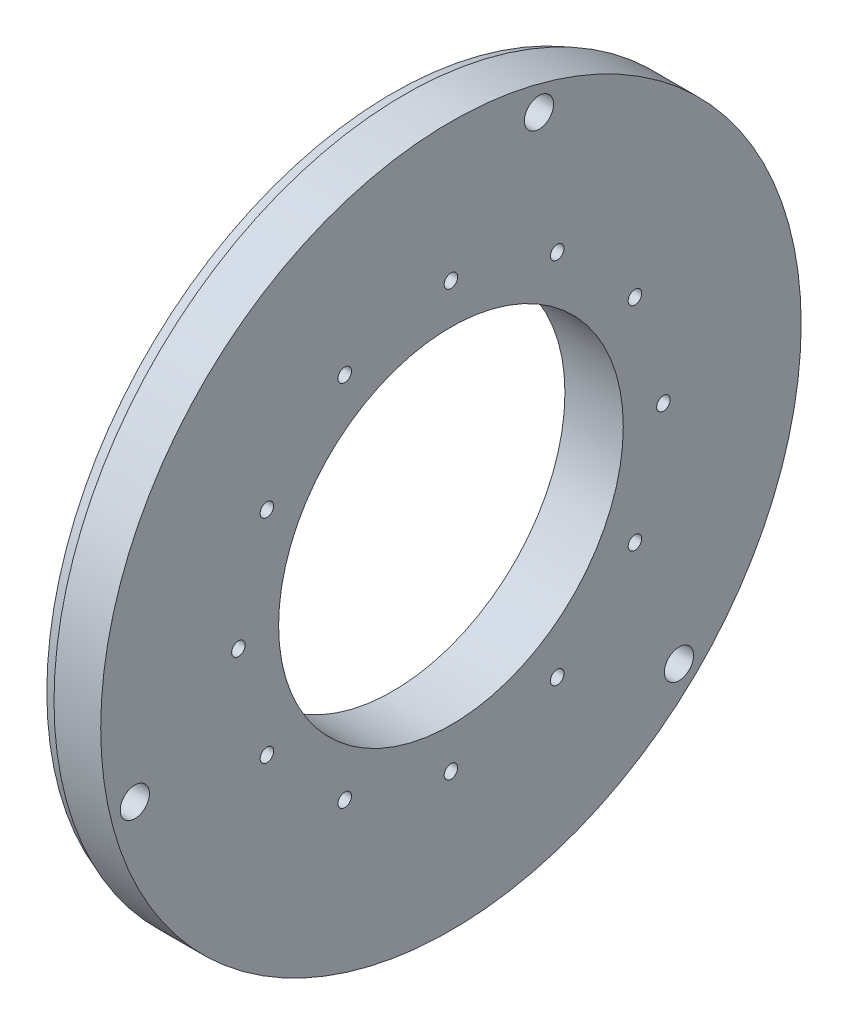
ISO-10303-21;
HEADER;
FILE_DESCRIPTION(('STEP AP214'),'2;1');
FILE_NAME('part.step','',(''),(''),'','','');
FILE_SCHEMA(('AUTOMOTIVE_DESIGN { 1 0 10303 214 1 1 1 1 }'));
ENDSEC;
DATA;
#1=APPLICATION_CONTEXT('core data for automotive mechanical design processes');
#2=APPLICATION_PROTOCOL_DEFINITION('international standard','automotive_design',2000,#1);
#3=PRODUCT_CONTEXT('',#1,'mechanical');
#4=PRODUCT('Part','Part','',(#3));
#5=PRODUCT_RELATED_PRODUCT_CATEGORY('part','',(#4));
#6=PRODUCT_DEFINITION_FORMATION('','',#4);
#7=PRODUCT_DEFINITION_CONTEXT('part definition',#1,'design');
#8=PRODUCT_DEFINITION('design','',#6,#7);
#9=PRODUCT_DEFINITION_SHAPE('','',#8);
#10=(LENGTH_UNIT() NAMED_UNIT(*) SI_UNIT(.MILLI.,.METRE.));
#11=(NAMED_UNIT(*) PLANE_ANGLE_UNIT() SI_UNIT($,.RADIAN.));
#12=(NAMED_UNIT(*) SI_UNIT($,.STERADIAN.) SOLID_ANGLE_UNIT());
#13=UNCERTAINTY_MEASURE_WITH_UNIT(LENGTH_MEASURE(1.E-05),#10,'distance_accuracy_value','');
#14=(GEOMETRIC_REPRESENTATION_CONTEXT(3) GLOBAL_UNCERTAINTY_ASSIGNED_CONTEXT((#13)) GLOBAL_UNIT_ASSIGNED_CONTEXT((#10,
#11,#12)) REPRESENTATION_CONTEXT('',''));
#15=CARTESIAN_POINT('',(0.,0.,0.));
#16=DIRECTION('',(0.,0.,1.));
#17=DIRECTION('',(1.,0.,0.));
#18=AXIS2_PLACEMENT_3D('',#15,#16,#17);
#19=CARTESIAN_POINT('',(12.7,0.,0.));
#20=DIRECTION('',(-1.,0.,0.));
#21=DIRECTION('',(0.,0.,1.));
#22=AXIS2_PLACEMENT_3D('',#19,#20,#21);
#23=CYLINDRICAL_SURFACE('',#22,76.2);
#24=CARTESIAN_POINT('',(12.7,0.,0.));
#25=DIRECTION('',(1.,0.,0.));
#26=DIRECTION('',(0.,0.,-1.));
#27=AXIS2_PLACEMENT_3D('',#24,#25,#26);
#28=CIRCLE('',#27,76.2);
#29=CARTESIAN_POINT('',(12.7,0.,-76.2));
#30=VERTEX_POINT('',#29);
#31=EDGE_CURVE('E11',#30,#30,#28,.T.);
#32=ORIENTED_EDGE('',*,*,#31,.F.);
#33=EDGE_LOOP('',(#32));
#34=FACE_BOUND('',#33,.T.);
#35=CARTESIAN_POINT('',(2.54,0.,0.));
#36=DIRECTION('',(-1.,0.,0.));
#37=DIRECTION('',(0.,0.,1.));
#38=AXIS2_PLACEMENT_3D('',#35,#36,#37);
#39=CIRCLE('',#38,76.2);
#40=CARTESIAN_POINT('',(2.54,0.,76.2));
#41=VERTEX_POINT('',#40);
#42=EDGE_CURVE('E46',#41,#41,#39,.T.);
#43=ORIENTED_EDGE('',*,*,#42,.F.);
#44=EDGE_LOOP('',(#43));
#45=FACE_BOUND('',#44,.T.);
#46=ADVANCED_FACE('F43',(#34,#45),#23,.T.);
#47=CARTESIAN_POINT('',(0.,0.,0.));
#48=DIRECTION('',(1.,0.,0.));
#49=DIRECTION('',(0.,0.,-1.));
#50=AXIS2_PLACEMENT_3D('',#47,#48,#49);
#51=PLANE('',#50);
#52=CARTESIAN_POINT('',(0.,0.,0.));
#53=DIRECTION('',(1.,0.,0.));
#54=DIRECTION('',(0.,0.,-1.));
#55=AXIS2_PLACEMENT_3D('',#52,#53,#54);
#56=CIRCLE('',#55,37.5);
#57=CARTESIAN_POINT('',(0.,0.,-37.5));
#58=VERTEX_POINT('',#57);
#59=EDGE_CURVE('E51',#58,#58,#56,.T.);
#60=ORIENTED_EDGE('',*,*,#59,.T.);
#61=EDGE_LOOP('',(#60));
#62=FACE_BOUND('',#61,.T.);
#63=CARTESIAN_POINT('',(0.,46.228,0.));
#64=DIRECTION('',(1.,0.,0.));
#65=DIRECTION('',(0.,0.,-1.));
#66=AXIS2_PLACEMENT_3D('',#63,#64,#65);
#67=CIRCLE('',#66,1.4732);
#68=CARTESIAN_POINT('',(0.,46.228,-1.4732));
#69=VERTEX_POINT('',#68);
#70=EDGE_CURVE('E61',#69,#69,#67,.T.);
#71=ORIENTED_EDGE('',*,*,#70,.T.);
#72=EDGE_LOOP('',(#71));
#73=FACE_BOUND('',#72,.T.);
#74=CARTESIAN_POINT('',(0.,40.034622366147,23.114));
#75=DIRECTION('',(1.,0.,0.));
#76=DIRECTION('',(0.,0.500000000000001,-0.866025403784438));
#77=AXIS2_PLACEMENT_3D('',#74,#75,#76);
#78=CIRCLE('',#77,1.4732);
#79=CARTESIAN_POINT('',(0.,40.771222366147,21.8381713751448));
#80=VERTEX_POINT('',#79);
#81=EDGE_CURVE('E67',#80,#80,#78,.T.);
#82=ORIENTED_EDGE('',*,*,#81,.T.);
#83=EDGE_LOOP('',(#82));
#84=FACE_BOUND('',#83,.T.);
#85=CARTESIAN_POINT('',(0.,40.0346223661473,-23.1139999999995));
#86=DIRECTION('',(1.,0.,0.));
#87=DIRECTION('',(0.,-0.499999999999989,-0.866025403784445));
#88=AXIS2_PLACEMENT_3D('',#85,#86,#87);
#89=CIRCLE('',#88,1.4732);
#90=CARTESIAN_POINT('',(0.,39.2980223661473,-24.3898286248547));
#91=VERTEX_POINT('',#90);
#92=EDGE_CURVE('E147',#91,#91,#89,.T.);
#93=ORIENTED_EDGE('',*,*,#92,.T.);
#94=EDGE_LOOP('',(#93));
#95=FACE_BOUND('',#94,.T.);
#96=CARTESIAN_POINT('',(0.,23.1140000000005,-40.0346223661468));
#97=DIRECTION('',(1.,0.,0.));
#98=DIRECTION('',(0.,-0.866025403784433,-0.50000000000001));
#99=AXIS2_PLACEMENT_3D('',#96,#97,#98);
#100=CIRCLE('',#99,1.4732);
#101=CARTESIAN_POINT('',(0.,21.8381713751452,-40.7712223661468));
#102=VERTEX_POINT('',#101);
#103=EDGE_CURVE('E84',#102,#102,#100,.T.);
#104=ORIENTED_EDGE('',*,*,#103,.T.);
#105=EDGE_LOOP('',(#104));
#106=FACE_BOUND('',#105,.T.);
#107=CARTESIAN_POINT('',(0.,4.84212597996121E-13,-46.228));
#108=DIRECTION('',(1.,0.,0.));
#109=DIRECTION('',(0.,-1.,0.));
#110=AXIS2_PLACEMENT_3D('',#107,#108,#109);
#111=CIRCLE('',#110,1.4732);
#112=CARTESIAN_POINT('',(0.,-1.47319999999952,-46.228));
#113=VERTEX_POINT('',#112);
#114=EDGE_CURVE('E83',#113,#113,#111,.T.);
#115=ORIENTED_EDGE('',*,*,#114,.T.);
#116=EDGE_LOOP('',(#115));
#117=FACE_BOUND('',#116,.T.);
#118=CARTESIAN_POINT('',(0.,-23.1139999999996,-40.0346223661472));
#119=DIRECTION('',(1.,0.,0.));
#120=DIRECTION('',(0.,-0.866025403784443,0.499999999999992));
#121=AXIS2_PLACEMENT_3D('',#118,#119,#120);
#122=CIRCLE('',#121,1.4732);
#123=CARTESIAN_POINT('',(0.,-24.3898286248549,-39.2980223661473));
#124=VERTEX_POINT('',#123);
#125=EDGE_CURVE('E92',#124,#124,#122,.T.);
#126=ORIENTED_EDGE('',*,*,#125,.T.);
#127=EDGE_LOOP('',(#126));
#128=FACE_BOUND('',#127,.T.);
#129=CARTESIAN_POINT('',(0.,-40.0346223661468,-23.1140000000003));
#130=DIRECTION('',(1.,0.,0.));
#131=DIRECTION('',(0.,-0.500000000000007,0.866025403784435));
#132=AXIS2_PLACEMENT_3D('',#129,#130,#131);
#133=CIRCLE('',#132,1.4732);
#134=CARTESIAN_POINT('',(0.,-40.7712223661469,-21.8381713751451));
#135=VERTEX_POINT('',#134);
#136=EDGE_CURVE('E100',#135,#135,#133,.T.);
#137=ORIENTED_EDGE('',*,*,#136,.T.);
#138=EDGE_LOOP('',(#137));
#139=FACE_BOUND('',#138,.T.);
#140=CARTESIAN_POINT('',(0.,-46.228,0.));
#141=DIRECTION('',(1.,0.,0.));
#142=DIRECTION('',(0.,0.,1.));
#143=AXIS2_PLACEMENT_3D('',#140,#141,#142);
#144=CIRCLE('',#143,1.4732);
#145=CARTESIAN_POINT('',(0.,-46.228,1.4732));
#146=VERTEX_POINT('',#145);
#147=EDGE_CURVE('E108',#146,#146,#144,.T.);
#148=ORIENTED_EDGE('',*,*,#147,.T.);
#149=EDGE_LOOP('',(#148));
#150=FACE_BOUND('',#149,.T.);
#151=CARTESIAN_POINT('',(0.,-40.0346223661472,23.1139999999998));
#152=DIRECTION('',(1.,0.,0.));
#153=DIRECTION('',(0.,0.499999999999995,0.866025403784442));
#154=AXIS2_PLACEMENT_3D('',#151,#152,#153);
#155=CIRCLE('',#154,1.4732);
#156=CARTESIAN_POINT('',(0.,-39.2980223661472,24.389828624855));
#157=VERTEX_POINT('',#156);
#158=EDGE_CURVE('E116',#157,#157,#155,.T.);
#159=ORIENTED_EDGE('',*,*,#158,.T.);
#160=EDGE_LOOP('',(#159));
#161=FACE_BOUND('',#160,.T.);
#162=CARTESIAN_POINT('',(0.,-23.1140000000002,40.0346223661469));
#163=DIRECTION('',(1.,0.,0.));
#164=DIRECTION('',(0.,0.866025403784436,0.500000000000004));
#165=AXIS2_PLACEMENT_3D('',#162,#163,#164);
#166=CIRCLE('',#165,1.4732);
#167=CARTESIAN_POINT('',(0.,-21.838171375145,40.7712223661469));
#168=VERTEX_POINT('',#167);
#169=EDGE_CURVE('E124',#168,#168,#166,.T.);
#170=ORIENTED_EDGE('',*,*,#169,.T.);
#171=EDGE_LOOP('',(#170));
#172=FACE_BOUND('',#171,.T.);
#173=CARTESIAN_POINT('',(0.,-1.6140419933204E-13,46.228));
#174=DIRECTION('',(1.,0.,0.));
#175=DIRECTION('',(0.,1.,0.));
#176=AXIS2_PLACEMENT_3D('',#173,#174,#175);
#177=CIRCLE('',#176,1.4732);
#178=CARTESIAN_POINT('',(0.,1.47319999999984,46.228));
#179=VERTEX_POINT('',#178);
#180=EDGE_CURVE('E132',#179,#179,#177,.T.);
#181=ORIENTED_EDGE('',*,*,#180,.T.);
#182=EDGE_LOOP('',(#181));
#183=FACE_BOUND('',#182,.T.);
#184=CARTESIAN_POINT('',(0.,23.1139999999999,40.0346223661471));
#185=DIRECTION('',(1.,0.,0.));
#186=DIRECTION('',(0.,0.86602540378444,-0.499999999999998));
#187=AXIS2_PLACEMENT_3D('',#184,#185,#186);
#188=CIRCLE('',#187,1.4732);
#189=CARTESIAN_POINT('',(0.,24.3898286248551,39.2980223661471));
#190=VERTEX_POINT('',#189);
#191=EDGE_CURVE('E75',#190,#190,#188,.T.);
#192=ORIENTED_EDGE('',*,*,#191,.T.);
#193=EDGE_LOOP('',(#192));
#194=FACE_BOUND('',#193,.T.);
#195=CARTESIAN_POINT('',(0.,68.3533593475034,-19.1596537564972));
#196=DIRECTION('',(1.,0.,0.));
#197=DIRECTION('',(0.,0.,-1.));
#198=AXIS2_PLACEMENT_3D('',#195,#196,#197);
#199=CIRCLE('',#198,3.175);
#200=CARTESIAN_POINT('',(0.,68.3533593475034,-22.3346537564972));
#201=VERTEX_POINT('',#200);
#202=EDGE_CURVE('E148',#201,#201,#199,.T.);
#203=ORIENTED_EDGE('',*,*,#202,.T.);
#204=EDGE_LOOP('',(#203));
#205=FACE_BOUND('',#204,.T.);
#206=CARTESIAN_POINT('',(0.,-50.7694265545918,-49.6159187506964));
#207=DIRECTION('',(1.,0.,0.));
#208=DIRECTION('',(0.,-0.866025403784443,0.499999999999992));
#209=AXIS2_PLACEMENT_3D('',#206,#207,#208);
#210=CIRCLE('',#209,3.175);
#211=CARTESIAN_POINT('',(0.,-53.5190572116074,-48.0284187506964));
#212=VERTEX_POINT('',#211);
#213=EDGE_CURVE('E171',#212,#212,#210,.T.);
#214=ORIENTED_EDGE('',*,*,#213,.T.);
#215=EDGE_LOOP('',(#214));
#216=FACE_BOUND('',#215,.T.);
#217=CARTESIAN_POINT('',(0.,-17.5839327929115,68.775572507193));
#218=DIRECTION('',(1.,0.,0.));
#219=DIRECTION('',(0.,0.866025403784436,0.500000000000004));
#220=AXIS2_PLACEMENT_3D('',#217,#218,#219);
#221=CIRCLE('',#220,3.175);
#222=CARTESIAN_POINT('',(0.,-14.834302135896,70.363072507193));
#223=VERTEX_POINT('',#222);
#224=EDGE_CURVE('E163',#223,#223,#221,.T.);
#225=ORIENTED_EDGE('',*,*,#224,.T.);
#226=EDGE_LOOP('',(#225));
#227=FACE_BOUND('',#226,.T.);
#228=CARTESIAN_POINT('',(0.,0.,0.));
#229=DIRECTION('',(-1.,0.,0.));
#230=DIRECTION('',(0.,0.,1.));
#231=AXIS2_PLACEMENT_3D('',#228,#229,#230);
#232=CIRCLE('',#231,75.2221);
#233=CARTESIAN_POINT('',(0.,0.,75.2221));
#234=VERTEX_POINT('',#233);
#235=EDGE_CURVE('E182',#234,#234,#232,.T.);
#236=ORIENTED_EDGE('',*,*,#235,.T.);
#237=EDGE_LOOP('',(#236));
#238=FACE_BOUND('',#237,.T.);
#239=ADVANCED_FACE('F198',(#62,#73,#84,#95,#106,#117,#128,#139,#150,#161,#172,#183,#194,#205,
#216,#227,#238),#51,.F.);
#240=CARTESIAN_POINT('',(12.7,0.,0.));
#241=DIRECTION('',(1.,0.,0.));
#242=DIRECTION('',(0.,0.,-1.));
#243=AXIS2_PLACEMENT_3D('',#240,#241,#242);
#244=PLANE('',#243);
#245=CARTESIAN_POINT('',(12.7,-17.5839327929115,68.775572507193));
#246=DIRECTION('',(1.,0.,0.));
#247=DIRECTION('',(0.,0.866025403784436,0.500000000000004));
#248=AXIS2_PLACEMENT_3D('',#245,#246,#247);
#249=CIRCLE('',#248,3.175);
#250=CARTESIAN_POINT('',(12.7,-14.834302135896,70.363072507193));
#251=VERTEX_POINT('',#250);
#252=EDGE_CURVE('E175',#251,#251,#249,.T.);
#253=ORIENTED_EDGE('',*,*,#252,.F.);
#254=EDGE_LOOP('',(#253));
#255=FACE_BOUND('',#254,.T.);
#256=CARTESIAN_POINT('',(12.7,-50.7694265545918,-49.6159187506964));
#257=DIRECTION('',(1.,0.,0.));
#258=DIRECTION('',(0.,-0.866025403784443,0.499999999999992));
#259=AXIS2_PLACEMENT_3D('',#256,#257,#258);
#260=CIRCLE('',#259,3.175);
#261=CARTESIAN_POINT('',(12.7,-53.5190572116074,-48.0284187506964));
#262=VERTEX_POINT('',#261);
#263=EDGE_CURVE('E167',#262,#262,#260,.T.);
#264=ORIENTED_EDGE('',*,*,#263,.F.);
#265=EDGE_LOOP('',(#264));
#266=FACE_BOUND('',#265,.T.);
#267=CARTESIAN_POINT('',(12.7,68.3533593475034,-19.1596537564972));
#268=DIRECTION('',(1.,0.,0.));
#269=DIRECTION('',(0.,0.,-1.));
#270=AXIS2_PLACEMENT_3D('',#267,#268,#269);
#271=CIRCLE('',#270,3.175);
#272=CARTESIAN_POINT('',(12.7,68.3533593475034,-22.3346537564972));
#273=VERTEX_POINT('',#272);
#274=EDGE_CURVE('E159',#273,#273,#271,.T.);
#275=ORIENTED_EDGE('',*,*,#274,.F.);
#276=EDGE_LOOP('',(#275));
#277=FACE_BOUND('',#276,.T.);
#278=CARTESIAN_POINT('',(12.7,23.1139999999999,40.0346223661471));
#279=DIRECTION('',(1.,0.,0.));
#280=DIRECTION('',(0.,0.86602540378444,-0.499999999999998));
#281=AXIS2_PLACEMENT_3D('',#278,#279,#280);
#282=CIRCLE('',#281,1.4732);
#283=CARTESIAN_POINT('',(12.7,24.3898286248551,39.2980223661471));
#284=VERTEX_POINT('',#283);
#285=EDGE_CURVE('E136',#284,#284,#282,.T.);
#286=ORIENTED_EDGE('',*,*,#285,.F.);
#287=EDGE_LOOP('',(#286));
#288=FACE_BOUND('',#287,.T.);
#289=CARTESIAN_POINT('',(12.7,-1.6140419933204E-13,46.228));
#290=DIRECTION('',(1.,0.,0.));
#291=DIRECTION('',(0.,1.,0.));
#292=AXIS2_PLACEMENT_3D('',#289,#290,#291);
#293=CIRCLE('',#292,1.4732);
#294=CARTESIAN_POINT('',(12.7,1.47319999999984,46.228));
#295=VERTEX_POINT('',#294);
#296=EDGE_CURVE('E128',#295,#295,#293,.T.);
#297=ORIENTED_EDGE('',*,*,#296,.F.);
#298=EDGE_LOOP('',(#297));
#299=FACE_BOUND('',#298,.T.);
#300=CARTESIAN_POINT('',(12.7,-23.1140000000002,40.0346223661469));
#301=DIRECTION('',(1.,0.,0.));
#302=DIRECTION('',(0.,0.866025403784436,0.500000000000004));
#303=AXIS2_PLACEMENT_3D('',#300,#301,#302);
#304=CIRCLE('',#303,1.4732);
#305=CARTESIAN_POINT('',(12.7,-21.838171375145,40.7712223661469));
#306=VERTEX_POINT('',#305);
#307=EDGE_CURVE('E120',#306,#306,#304,.T.);
#308=ORIENTED_EDGE('',*,*,#307,.F.);
#309=EDGE_LOOP('',(#308));
#310=FACE_BOUND('',#309,.T.);
#311=CARTESIAN_POINT('',(12.7,-40.0346223661472,23.1139999999998));
#312=DIRECTION('',(1.,0.,0.));
#313=DIRECTION('',(0.,0.499999999999995,0.866025403784442));
#314=AXIS2_PLACEMENT_3D('',#311,#312,#313);
#315=CIRCLE('',#314,1.4732);
#316=CARTESIAN_POINT('',(12.7,-39.2980223661472,24.389828624855));
#317=VERTEX_POINT('',#316);
#318=EDGE_CURVE('E112',#317,#317,#315,.T.);
#319=ORIENTED_EDGE('',*,*,#318,.F.);
#320=EDGE_LOOP('',(#319));
#321=FACE_BOUND('',#320,.T.);
#322=CARTESIAN_POINT('',(12.7,-46.228,0.));
#323=DIRECTION('',(1.,0.,0.));
#324=DIRECTION('',(0.,0.,1.));
#325=AXIS2_PLACEMENT_3D('',#322,#323,#324);
#326=CIRCLE('',#325,1.4732);
#327=CARTESIAN_POINT('',(12.7,-46.228,1.4732));
#328=VERTEX_POINT('',#327);
#329=EDGE_CURVE('E104',#328,#328,#326,.T.);
#330=ORIENTED_EDGE('',*,*,#329,.F.);
#331=EDGE_LOOP('',(#330));
#332=FACE_BOUND('',#331,.T.);
#333=CARTESIAN_POINT('',(12.7,-40.0346223661468,-23.1140000000003));
#334=DIRECTION('',(1.,0.,0.));
#335=DIRECTION('',(0.,-0.500000000000007,0.866025403784435));
#336=AXIS2_PLACEMENT_3D('',#333,#334,#335);
#337=CIRCLE('',#336,1.4732);
#338=CARTESIAN_POINT('',(12.7,-40.7712223661469,-21.8381713751451));
#339=VERTEX_POINT('',#338);
#340=EDGE_CURVE('E96',#339,#339,#337,.T.);
#341=ORIENTED_EDGE('',*,*,#340,.F.);
#342=EDGE_LOOP('',(#341));
#343=FACE_BOUND('',#342,.T.);
#344=CARTESIAN_POINT('',(12.7,-23.1139999999996,-40.0346223661472));
#345=DIRECTION('',(1.,0.,0.));
#346=DIRECTION('',(0.,-0.866025403784443,0.499999999999992));
#347=AXIS2_PLACEMENT_3D('',#344,#345,#346);
#348=CIRCLE('',#347,1.4732);
#349=CARTESIAN_POINT('',(12.7,-24.3898286248549,-39.2980223661473));
#350=VERTEX_POINT('',#349);
#351=EDGE_CURVE('E88',#350,#350,#348,.T.);
#352=ORIENTED_EDGE('',*,*,#351,.F.);
#353=EDGE_LOOP('',(#352));
#354=FACE_BOUND('',#353,.T.);
#355=CARTESIAN_POINT('',(12.7,4.84212597996121E-13,-46.228));
#356=DIRECTION('',(1.,0.,0.));
#357=DIRECTION('',(0.,-1.,0.));
#358=AXIS2_PLACEMENT_3D('',#355,#356,#357);
#359=CIRCLE('',#358,1.4732);
#360=CARTESIAN_POINT('',(12.7,-1.47319999999952,-46.228));
#361=VERTEX_POINT('',#360);
#362=EDGE_CURVE('E79',#361,#361,#359,.T.);
#363=ORIENTED_EDGE('',*,*,#362,.F.);
#364=EDGE_LOOP('',(#363));
#365=FACE_BOUND('',#364,.T.);
#366=CARTESIAN_POINT('',(12.7,23.1140000000005,-40.0346223661468));
#367=DIRECTION('',(1.,0.,0.));
#368=DIRECTION('',(0.,-0.866025403784433,-0.50000000000001));
#369=AXIS2_PLACEMENT_3D('',#366,#367,#368);
#370=CIRCLE('',#369,1.4732);
#371=CARTESIAN_POINT('',(12.7,21.8381713751452,-40.7712223661468));
#372=VERTEX_POINT('',#371);
#373=EDGE_CURVE('E152',#372,#372,#370,.T.);
#374=ORIENTED_EDGE('',*,*,#373,.F.);
#375=EDGE_LOOP('',(#374));
#376=FACE_BOUND('',#375,.T.);
#377=CARTESIAN_POINT('',(12.7,40.0346223661473,-23.1139999999995));
#378=DIRECTION('',(1.,0.,0.));
#379=DIRECTION('',(0.,-0.499999999999989,-0.866025403784445));
#380=AXIS2_PLACEMENT_3D('',#377,#378,#379);
#381=CIRCLE('',#380,1.4732);
#382=CARTESIAN_POINT('',(12.7,39.2980223661473,-24.3898286248547));
#383=VERTEX_POINT('',#382);
#384=EDGE_CURVE('E143',#383,#383,#381,.T.);
#385=ORIENTED_EDGE('',*,*,#384,.F.);
#386=EDGE_LOOP('',(#385));
#387=FACE_BOUND('',#386,.T.);
#388=CARTESIAN_POINT('',(12.7,40.034622366147,23.114));
#389=DIRECTION('',(1.,0.,0.));
#390=DIRECTION('',(0.,0.500000000000001,-0.866025403784438));
#391=AXIS2_PLACEMENT_3D('',#388,#389,#390);
#392=CIRCLE('',#391,1.4732);
#393=CARTESIAN_POINT('',(12.7,40.771222366147,21.8381713751448));
#394=VERTEX_POINT('',#393);
#395=EDGE_CURVE('E71',#394,#394,#392,.T.);
#396=ORIENTED_EDGE('',*,*,#395,.F.);
#397=EDGE_LOOP('',(#396));
#398=FACE_BOUND('',#397,.T.);
#399=CARTESIAN_POINT('',(12.7,46.228,0.));
#400=DIRECTION('',(1.,0.,0.));
#401=DIRECTION('',(0.,0.,-1.));
#402=AXIS2_PLACEMENT_3D('',#399,#400,#401);
#403=CIRCLE('',#402,1.4732);
#404=CARTESIAN_POINT('',(12.7,46.228,-1.4732));
#405=VERTEX_POINT('',#404);
#406=EDGE_CURVE('E63',#405,#405,#403,.T.);
#407=ORIENTED_EDGE('',*,*,#406,.F.);
#408=EDGE_LOOP('',(#407));
#409=FACE_BOUND('',#408,.T.);
#410=CARTESIAN_POINT('',(12.7,0.,0.));
#411=DIRECTION('',(1.,0.,0.));
#412=DIRECTION('',(0.,0.,-1.));
#413=AXIS2_PLACEMENT_3D('',#410,#411,#412);
#414=CIRCLE('',#413,37.5);
#415=CARTESIAN_POINT('',(12.7,0.,-37.5));
#416=VERTEX_POINT('',#415);
#417=EDGE_CURVE('E56',#416,#416,#414,.T.);
#418=ORIENTED_EDGE('',*,*,#417,.F.);
#419=EDGE_LOOP('',(#418));
#420=FACE_BOUND('',#419,.T.);
#421=ORIENTED_EDGE('',*,*,#31,.T.);
#422=EDGE_LOOP('',(#421));
#423=FACE_BOUND('',#422,.T.);
#424=ADVANCED_FACE('F204',(#255,#266,#277,#288,#299,#310,#321,#332,#343,#354,#365,#376,#387,
#398,#409,#420,#423),#244,.T.);
#425=CARTESIAN_POINT('',(0.,0.,0.));
#426=DIRECTION('',(1.,0.,0.));
#427=DIRECTION('',(0.,0.,-1.));
#428=AXIS2_PLACEMENT_3D('',#425,#426,#427);
#429=CYLINDRICAL_SURFACE('',#428,37.5);
#430=ORIENTED_EDGE('',*,*,#59,.F.);
#431=EDGE_LOOP('',(#430));
#432=FACE_BOUND('',#431,.T.);
#433=ORIENTED_EDGE('',*,*,#417,.T.);
#434=EDGE_LOOP('',(#433));
#435=FACE_BOUND('',#434,.T.);
#436=ADVANCED_FACE('F210',(#432,#435),#429,.F.);
#437=CARTESIAN_POINT('',(0.,46.228,0.));
#438=DIRECTION('',(1.,0.,0.));
#439=DIRECTION('',(0.,0.,-1.));
#440=AXIS2_PLACEMENT_3D('',#437,#438,#439);
#441=CYLINDRICAL_SURFACE('',#440,1.4732);
#442=ORIENTED_EDGE('',*,*,#70,.F.);
#443=EDGE_LOOP('',(#442));
#444=FACE_BOUND('',#443,.T.);
#445=ORIENTED_EDGE('',*,*,#406,.T.);
#446=EDGE_LOOP('',(#445));
#447=FACE_BOUND('',#446,.T.);
#448=ADVANCED_FACE('F217',(#444,#447),#441,.F.);
#449=CARTESIAN_POINT('',(0.,40.034622366147,23.114));
#450=DIRECTION('',(1.,0.,0.));
#451=DIRECTION('',(0.,0.,-1.));
#452=AXIS2_PLACEMENT_3D('',#449,#450,#451);
#453=CYLINDRICAL_SURFACE('',#452,1.4732);
#454=ORIENTED_EDGE('',*,*,#81,.F.);
#455=EDGE_LOOP('',(#454));
#456=FACE_BOUND('',#455,.T.);
#457=ORIENTED_EDGE('',*,*,#395,.T.);
#458=EDGE_LOOP('',(#457));
#459=FACE_BOUND('',#458,.T.);
#460=ADVANCED_FACE('F221',(#456,#459),#453,.F.);
#461=CARTESIAN_POINT('',(0.,40.0346223661473,-23.1139999999995));
#462=DIRECTION('',(1.,0.,0.));
#463=DIRECTION('',(0.,0.,-1.));
#464=AXIS2_PLACEMENT_3D('',#461,#462,#463);
#465=CYLINDRICAL_SURFACE('',#464,1.4732);
#466=ORIENTED_EDGE('',*,*,#92,.F.);
#467=EDGE_LOOP('',(#466));
#468=FACE_BOUND('',#467,.T.);
#469=ORIENTED_EDGE('',*,*,#384,.T.);
#470=EDGE_LOOP('',(#469));
#471=FACE_BOUND('',#470,.T.);
#472=ADVANCED_FACE('F225',(#468,#471),#465,.F.);
#473=CARTESIAN_POINT('',(0.,23.1140000000005,-40.0346223661468));
#474=DIRECTION('',(1.,0.,0.));
#475=DIRECTION('',(0.,0.,-1.));
#476=AXIS2_PLACEMENT_3D('',#473,#474,#475);
#477=CYLINDRICAL_SURFACE('',#476,1.4732);
#478=ORIENTED_EDGE('',*,*,#103,.F.);
#479=EDGE_LOOP('',(#478));
#480=FACE_BOUND('',#479,.T.);
#481=ORIENTED_EDGE('',*,*,#373,.T.);
#482=EDGE_LOOP('',(#481));
#483=FACE_BOUND('',#482,.T.);
#484=ADVANCED_FACE('F231',(#480,#483),#477,.F.);
#485=CARTESIAN_POINT('',(0.,4.84212597996121E-13,-46.228));
#486=DIRECTION('',(1.,0.,0.));
#487=DIRECTION('',(0.,0.,-1.));
#488=AXIS2_PLACEMENT_3D('',#485,#486,#487);
#489=CYLINDRICAL_SURFACE('',#488,1.4732);
#490=ORIENTED_EDGE('',*,*,#114,.F.);
#491=EDGE_LOOP('',(#490));
#492=FACE_BOUND('',#491,.T.);
#493=ORIENTED_EDGE('',*,*,#362,.T.);
#494=EDGE_LOOP('',(#493));
#495=FACE_BOUND('',#494,.T.);
#496=ADVANCED_FACE('F227',(#492,#495),#489,.F.);
#497=CARTESIAN_POINT('',(0.,-23.1139999999996,-40.0346223661472));
#498=DIRECTION('',(1.,0.,0.));
#499=DIRECTION('',(0.,0.,-1.));
#500=AXIS2_PLACEMENT_3D('',#497,#498,#499);
#501=CYLINDRICAL_SURFACE('',#500,1.4732);
#502=ORIENTED_EDGE('',*,*,#125,.F.);
#503=EDGE_LOOP('',(#502));
#504=FACE_BOUND('',#503,.T.);
#505=ORIENTED_EDGE('',*,*,#351,.T.);
#506=EDGE_LOOP('',(#505));
#507=FACE_BOUND('',#506,.T.);
#508=ADVANCED_FACE('F230',(#504,#507),#501,.F.);
#509=CARTESIAN_POINT('',(0.,-40.0346223661468,-23.1140000000003));
#510=DIRECTION('',(1.,0.,0.));
#511=DIRECTION('',(0.,0.,-1.));
#512=AXIS2_PLACEMENT_3D('',#509,#510,#511);
#513=CYLINDRICAL_SURFACE('',#512,1.4732);
#514=ORIENTED_EDGE('',*,*,#136,.F.);
#515=EDGE_LOOP('',(#514));
#516=FACE_BOUND('',#515,.T.);
#517=ORIENTED_EDGE('',*,*,#340,.T.);
#518=EDGE_LOOP('',(#517));
#519=FACE_BOUND('',#518,.T.);
#520=ADVANCED_FACE('F235',(#516,#519),#513,.F.);
#521=CARTESIAN_POINT('',(0.,-46.228,0.));
#522=DIRECTION('',(1.,0.,0.));
#523=DIRECTION('',(0.,0.,-1.));
#524=AXIS2_PLACEMENT_3D('',#521,#522,#523);
#525=CYLINDRICAL_SURFACE('',#524,1.4732);
#526=ORIENTED_EDGE('',*,*,#147,.F.);
#527=EDGE_LOOP('',(#526));
#528=FACE_BOUND('',#527,.T.);
#529=ORIENTED_EDGE('',*,*,#329,.T.);
#530=EDGE_LOOP('',(#529));
#531=FACE_BOUND('',#530,.T.);
#532=ADVANCED_FACE('F239',(#528,#531),#525,.F.);
#533=CARTESIAN_POINT('',(0.,-40.0346223661472,23.1139999999998));
#534=DIRECTION('',(1.,0.,0.));
#535=DIRECTION('',(0.,0.,-1.));
#536=AXIS2_PLACEMENT_3D('',#533,#534,#535);
#537=CYLINDRICAL_SURFACE('',#536,1.4732);
#538=ORIENTED_EDGE('',*,*,#158,.F.);
#539=EDGE_LOOP('',(#538));
#540=FACE_BOUND('',#539,.T.);
#541=ORIENTED_EDGE('',*,*,#318,.T.);
#542=EDGE_LOOP('',(#541));
#543=FACE_BOUND('',#542,.T.);
#544=ADVANCED_FACE('F243',(#540,#543),#537,.F.);
#545=CARTESIAN_POINT('',(0.,-23.1140000000002,40.0346223661469));
#546=DIRECTION('',(1.,0.,0.));
#547=DIRECTION('',(0.,0.,-1.));
#548=AXIS2_PLACEMENT_3D('',#545,#546,#547);
#549=CYLINDRICAL_SURFACE('',#548,1.4732);
#550=ORIENTED_EDGE('',*,*,#169,.F.);
#551=EDGE_LOOP('',(#550));
#552=FACE_BOUND('',#551,.T.);
#553=ORIENTED_EDGE('',*,*,#307,.T.);
#554=EDGE_LOOP('',(#553));
#555=FACE_BOUND('',#554,.T.);
#556=ADVANCED_FACE('F247',(#552,#555),#549,.F.);
#557=CARTESIAN_POINT('',(0.,-1.6140419933204E-13,46.228));
#558=DIRECTION('',(1.,0.,0.));
#559=DIRECTION('',(0.,0.,-1.));
#560=AXIS2_PLACEMENT_3D('',#557,#558,#559);
#561=CYLINDRICAL_SURFACE('',#560,1.4732);
#562=ORIENTED_EDGE('',*,*,#180,.F.);
#563=EDGE_LOOP('',(#562));
#564=FACE_BOUND('',#563,.T.);
#565=ORIENTED_EDGE('',*,*,#296,.T.);
#566=EDGE_LOOP('',(#565));
#567=FACE_BOUND('',#566,.T.);
#568=ADVANCED_FACE('F251',(#564,#567),#561,.F.);
#569=CARTESIAN_POINT('',(0.,23.1139999999999,40.0346223661471));
#570=DIRECTION('',(1.,0.,0.));
#571=DIRECTION('',(0.,0.,-1.));
#572=AXIS2_PLACEMENT_3D('',#569,#570,#571);
#573=CYLINDRICAL_SURFACE('',#572,1.4732);
#574=ORIENTED_EDGE('',*,*,#191,.F.);
#575=EDGE_LOOP('',(#574));
#576=FACE_BOUND('',#575,.T.);
#577=ORIENTED_EDGE('',*,*,#285,.T.);
#578=EDGE_LOOP('',(#577));
#579=FACE_BOUND('',#578,.T.);
#580=ADVANCED_FACE('F255',(#576,#579),#573,.F.);
#581=CARTESIAN_POINT('',(0.,68.3533593475034,-19.1596537564972));
#582=DIRECTION('',(1.,0.,0.));
#583=DIRECTION('',(0.,0.,-1.));
#584=AXIS2_PLACEMENT_3D('',#581,#582,#583);
#585=CYLINDRICAL_SURFACE('',#584,3.175);
#586=ORIENTED_EDGE('',*,*,#202,.F.);
#587=EDGE_LOOP('',(#586));
#588=FACE_BOUND('',#587,.T.);
#589=ORIENTED_EDGE('',*,*,#274,.T.);
#590=EDGE_LOOP('',(#589));
#591=FACE_BOUND('',#590,.T.);
#592=ADVANCED_FACE('F259',(#588,#591),#585,.F.);
#593=CARTESIAN_POINT('',(0.,-50.7694265545918,-49.6159187506964));
#594=DIRECTION('',(1.,0.,0.));
#595=DIRECTION('',(0.,0.,-1.));
#596=AXIS2_PLACEMENT_3D('',#593,#594,#595);
#597=CYLINDRICAL_SURFACE('',#596,3.175);
#598=ORIENTED_EDGE('',*,*,#213,.F.);
#599=EDGE_LOOP('',(#598));
#600=FACE_BOUND('',#599,.T.);
#601=ORIENTED_EDGE('',*,*,#263,.T.);
#602=EDGE_LOOP('',(#601));
#603=FACE_BOUND('',#602,.T.);
#604=ADVANCED_FACE('F269',(#600,#603),#597,.F.);
#605=CARTESIAN_POINT('',(0.,-17.5839327929115,68.775572507193));
#606=DIRECTION('',(1.,0.,0.));
#607=DIRECTION('',(0.,0.,-1.));
#608=AXIS2_PLACEMENT_3D('',#605,#606,#607);
#609=CYLINDRICAL_SURFACE('',#608,3.175);
#610=ORIENTED_EDGE('',*,*,#224,.F.);
#611=EDGE_LOOP('',(#610));
#612=FACE_BOUND('',#611,.T.);
#613=ORIENTED_EDGE('',*,*,#252,.T.);
#614=EDGE_LOOP('',(#613));
#615=FACE_BOUND('',#614,.T.);
#616=ADVANCED_FACE('F273',(#612,#615),#609,.F.);
#617=CARTESIAN_POINT('',(2.54,0.,0.));
#618=DIRECTION('',(-1.,0.,0.));
#619=DIRECTION('',(0.,0.,1.));
#620=AXIS2_PLACEMENT_3D('',#617,#618,#619);
#621=PLANE('',#620);
#622=CARTESIAN_POINT('',(2.54,0.,0.));
#623=DIRECTION('',(-1.,0.,0.));
#624=DIRECTION('',(0.,0.,1.));
#625=AXIS2_PLACEMENT_3D('',#622,#623,#624);
#626=CIRCLE('',#625,75.2221);
#627=CARTESIAN_POINT('',(2.54,0.,75.2221));
#628=VERTEX_POINT('',#627);
#629=EDGE_CURVE('E186',#628,#628,#626,.T.);
#630=ORIENTED_EDGE('',*,*,#629,.F.);
#631=EDGE_LOOP('',(#630));
#632=FACE_BOUND('',#631,.T.);
#633=ORIENTED_EDGE('',*,*,#42,.T.);
#634=EDGE_LOOP('',(#633));
#635=FACE_BOUND('',#634,.T.);
#636=ADVANCED_FACE('F195',(#632,#635),#621,.T.);
#637=CARTESIAN_POINT('',(2.54,0.,0.));
#638=DIRECTION('',(-1.,0.,0.));
#639=DIRECTION('',(0.,0.,1.));
#640=AXIS2_PLACEMENT_3D('',#637,#638,#639);
#641=CYLINDRICAL_SURFACE('',#640,75.2221);
#642=ORIENTED_EDGE('',*,*,#629,.T.);
#643=EDGE_LOOP('',(#642));
#644=FACE_BOUND('',#643,.T.);
#645=ORIENTED_EDGE('',*,*,#235,.F.);
#646=EDGE_LOOP('',(#645));
#647=FACE_BOUND('',#646,.T.);
#648=ADVANCED_FACE('F278',(#644,#647),#641,.T.);
#649=CLOSED_SHELL('',(#46,#239,#424,#436,#448,#460,#472,#484,#496,#508,#520,#532,#544,#556,#568,
#580,#592,#604,#616,#636,#648));
#650=MANIFOLD_SOLID_BREP('B2',#649);
#651=ADVANCED_BREP_SHAPE_REPRESENTATION('',(#18,#650),#14);
#652=SHAPE_DEFINITION_REPRESENTATION(#9,#651);
ENDSEC;
END-ISO-10303-21;
